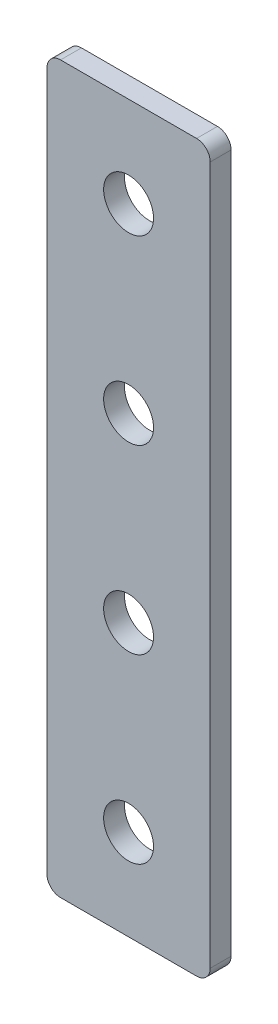
ISO-10303-21;
HEADER;
FILE_DESCRIPTION(('STEP AP214'),'2;1');
FILE_NAME('part.step','',(''),(''),'','','');
FILE_SCHEMA(('AUTOMOTIVE_DESIGN { 1 0 10303 214 1 1 1 1 }'));
ENDSEC;
DATA;
#1=APPLICATION_CONTEXT('core data for automotive mechanical design processes');
#2=APPLICATION_PROTOCOL_DEFINITION('international standard','automotive_design',2000,#1);
#3=PRODUCT_CONTEXT('',#1,'mechanical');
#4=PRODUCT('Part','Part','',(#3));
#5=PRODUCT_RELATED_PRODUCT_CATEGORY('part','',(#4));
#6=PRODUCT_DEFINITION_FORMATION('','',#4);
#7=PRODUCT_DEFINITION_CONTEXT('part definition',#1,'design');
#8=PRODUCT_DEFINITION('design','',#6,#7);
#9=PRODUCT_DEFINITION_SHAPE('','',#8);
#10=(LENGTH_UNIT() NAMED_UNIT(*) SI_UNIT(.MILLI.,.METRE.));
#11=(NAMED_UNIT(*) PLANE_ANGLE_UNIT() SI_UNIT($,.RADIAN.));
#12=(NAMED_UNIT(*) SI_UNIT($,.STERADIAN.) SOLID_ANGLE_UNIT());
#13=UNCERTAINTY_MEASURE_WITH_UNIT(LENGTH_MEASURE(1.E-05),#10,'distance_accuracy_value','');
#14=(GEOMETRIC_REPRESENTATION_CONTEXT(3) GLOBAL_UNCERTAINTY_ASSIGNED_CONTEXT((#13)) GLOBAL_UNIT_ASSIGNED_CONTEXT((#10,
#11,#12)) REPRESENTATION_CONTEXT('',''));
#15=CARTESIAN_POINT('',(0.,0.,0.));
#16=DIRECTION('',(0.,0.,1.));
#17=DIRECTION('',(1.,0.,0.));
#18=AXIS2_PLACEMENT_3D('',#15,#16,#17);
#19=CARTESIAN_POINT('',(-7.49999999999996,1.50000000000004,-2.3));
#20=DIRECTION('',(0.,0.,1.));
#21=DIRECTION('',(1.,0.,0.));
#22=AXIS2_PLACEMENT_3D('',#19,#20,#21);
#23=CYLINDRICAL_SURFACE('',#22,1.50000000000004);
#24=CARTESIAN_POINT('',(-7.49999999999996,1.50000000000004,0.));
#25=DIRECTION('',(0.,0.,1.));
#26=DIRECTION('',(1.,0.,0.));
#27=AXIS2_PLACEMENT_3D('',#24,#25,#26);
#28=CIRCLE('',#27,1.50000000000004);
#29=CARTESIAN_POINT('',(-9.,1.5,0.));
#30=VERTEX_POINT('',#29);
#31=CARTESIAN_POINT('',(-7.5,0.,0.));
#32=VERTEX_POINT('',#31);
#33=EDGE_CURVE('E132',#30,#32,#28,.T.);
#34=ORIENTED_EDGE('',*,*,#33,.F.);
#35=DIRECTION('',(0.,0.,1.));
#36=VECTOR('',#35,1.);
#37=CARTESIAN_POINT('',(-9.,1.5,-2.3));
#38=LINE('',#37,#36);
#39=CARTESIAN_POINT('',(-9.,1.5,-2.3));
#40=VERTEX_POINT('',#39);
#41=EDGE_CURVE('E11',#40,#30,#38,.T.);
#42=ORIENTED_EDGE('',*,*,#41,.F.);
#43=CARTESIAN_POINT('',(-7.49999999999996,1.50000000000004,-2.3));
#44=DIRECTION('',(0.,0.,1.));
#45=DIRECTION('',(1.,0.,0.));
#46=AXIS2_PLACEMENT_3D('',#43,#44,#45);
#47=CIRCLE('',#46,1.50000000000004);
#48=CARTESIAN_POINT('',(-7.5,0.,-2.3));
#49=VERTEX_POINT('',#48);
#50=EDGE_CURVE('E153',#40,#49,#47,.T.);
#51=ORIENTED_EDGE('',*,*,#50,.T.);
#52=DIRECTION('',(0.,0.,1.));
#53=VECTOR('',#52,1.);
#54=CARTESIAN_POINT('',(-7.5,0.,-2.3));
#55=LINE('',#54,#53);
#56=EDGE_CURVE('E38',#49,#32,#55,.T.);
#57=ORIENTED_EDGE('',*,*,#56,.T.);
#58=EDGE_LOOP('',(#34,#42,#51,#57));
#59=FACE_BOUND('',#58,.T.);
#60=ADVANCED_FACE('F35',(#59),#23,.T.);
#61=CARTESIAN_POINT('',(-9.,78.5,-2.3));
#62=DIRECTION('',(-1.,0.,0.));
#63=DIRECTION('',(0.,0.,1.));
#64=AXIS2_PLACEMENT_3D('',#61,#62,#63);
#65=PLANE('',#64);
#66=DIRECTION('',(0.,-1.,0.));
#67=VECTOR('',#66,1.);
#68=CARTESIAN_POINT('',(-9.,78.5,0.));
#69=LINE('',#68,#67);
#70=CARTESIAN_POINT('',(-9.,78.5,0.));
#71=VERTEX_POINT('',#70);
#72=EDGE_CURVE('E151',#71,#30,#69,.T.);
#73=ORIENTED_EDGE('',*,*,#72,.F.);
#74=DIRECTION('',(0.,0.,1.));
#75=VECTOR('',#74,1.);
#76=CARTESIAN_POINT('',(-9.,78.5,-2.3));
#77=LINE('',#76,#75);
#78=CARTESIAN_POINT('',(-9.,78.5,-2.3));
#79=VERTEX_POINT('',#78);
#80=EDGE_CURVE('E44',#79,#71,#77,.T.);
#81=ORIENTED_EDGE('',*,*,#80,.F.);
#82=DIRECTION('',(0.,-1.,0.));
#83=VECTOR('',#82,1.);
#84=CARTESIAN_POINT('',(-9.,78.5,-2.3));
#85=LINE('',#84,#83);
#86=EDGE_CURVE('E122',#79,#40,#85,.T.);
#87=ORIENTED_EDGE('',*,*,#86,.T.);
#88=ORIENTED_EDGE('',*,*,#41,.T.);
#89=EDGE_LOOP('',(#73,#81,#87,#88));
#90=FACE_BOUND('',#89,.T.);
#91=ADVANCED_FACE('F165',(#90),#65,.T.);
#92=CARTESIAN_POINT('',(-7.50000000000026,78.5000000000003,-2.3));
#93=DIRECTION('',(0.,0.,1.));
#94=DIRECTION('',(1.,0.,0.));
#95=AXIS2_PLACEMENT_3D('',#92,#93,#94);
#96=CYLINDRICAL_SURFACE('',#95,1.49999999999974);
#97=CARTESIAN_POINT('',(-7.50000000000026,78.5000000000003,0.));
#98=DIRECTION('',(0.,0.,1.));
#99=DIRECTION('',(1.,0.,0.));
#100=AXIS2_PLACEMENT_3D('',#97,#98,#99);
#101=CIRCLE('',#100,1.49999999999974);
#102=CARTESIAN_POINT('',(-7.5,80.,0.));
#103=VERTEX_POINT('',#102);
#104=EDGE_CURVE('E109',#103,#71,#101,.T.);
#105=ORIENTED_EDGE('',*,*,#104,.F.);
#106=DIRECTION('',(0.,0.,1.));
#107=VECTOR('',#106,1.);
#108=CARTESIAN_POINT('',(-7.5,80.,-2.3));
#109=LINE('',#108,#107);
#110=CARTESIAN_POINT('',(-7.5,80.,-2.3));
#111=VERTEX_POINT('',#110);
#112=EDGE_CURVE('E104',#111,#103,#109,.T.);
#113=ORIENTED_EDGE('',*,*,#112,.F.);
#114=CARTESIAN_POINT('',(-7.50000000000026,78.5000000000003,-2.3));
#115=DIRECTION('',(0.,0.,1.));
#116=DIRECTION('',(1.,0.,0.));
#117=AXIS2_PLACEMENT_3D('',#114,#115,#116);
#118=CIRCLE('',#117,1.49999999999974);
#119=EDGE_CURVE('E107',#111,#79,#118,.T.);
#120=ORIENTED_EDGE('',*,*,#119,.T.);
#121=ORIENTED_EDGE('',*,*,#80,.T.);
#122=EDGE_LOOP('',(#105,#113,#120,#121));
#123=FACE_BOUND('',#122,.T.);
#124=ADVANCED_FACE('F106',(#123),#96,.T.);
#125=CARTESIAN_POINT('',(7.5,80.,-2.3));
#126=DIRECTION('',(0.,1.,0.));
#127=DIRECTION('',(0.,0.,1.));
#128=AXIS2_PLACEMENT_3D('',#125,#126,#127);
#129=PLANE('',#128);
#130=DIRECTION('',(-1.,0.,0.));
#131=VECTOR('',#130,1.);
#132=CARTESIAN_POINT('',(7.5,80.,0.));
#133=LINE('',#132,#131);
#134=CARTESIAN_POINT('',(7.5,80.,0.));
#135=VERTEX_POINT('',#134);
#136=EDGE_CURVE('E148',#135,#103,#133,.T.);
#137=ORIENTED_EDGE('',*,*,#136,.F.);
#138=DIRECTION('',(0.,0.,1.));
#139=VECTOR('',#138,1.);
#140=CARTESIAN_POINT('',(7.5,80.,-2.3));
#141=LINE('',#140,#139);
#142=CARTESIAN_POINT('',(7.5,80.,-2.3));
#143=VERTEX_POINT('',#142);
#144=EDGE_CURVE('E114',#143,#135,#141,.T.);
#145=ORIENTED_EDGE('',*,*,#144,.F.);
#146=DIRECTION('',(-1.,0.,0.));
#147=VECTOR('',#146,1.);
#148=CARTESIAN_POINT('',(7.5,80.,-2.3));
#149=LINE('',#148,#147);
#150=EDGE_CURVE('E120',#143,#111,#149,.T.);
#151=ORIENTED_EDGE('',*,*,#150,.T.);
#152=ORIENTED_EDGE('',*,*,#112,.T.);
#153=EDGE_LOOP('',(#137,#145,#151,#152));
#154=FACE_BOUND('',#153,.T.);
#155=ADVANCED_FACE('F124',(#154),#129,.T.);
#156=CARTESIAN_POINT('',(7.50000000000026,78.5000000000003,-2.3));
#157=DIRECTION('',(0.,0.,1.));
#158=DIRECTION('',(1.,0.,0.));
#159=AXIS2_PLACEMENT_3D('',#156,#157,#158);
#160=CYLINDRICAL_SURFACE('',#159,1.49999999999974);
#161=CARTESIAN_POINT('',(7.50000000000026,78.5000000000003,0.));
#162=DIRECTION('',(0.,0.,1.));
#163=DIRECTION('',(1.,0.,0.));
#164=AXIS2_PLACEMENT_3D('',#161,#162,#163);
#165=CIRCLE('',#164,1.49999999999974);
#166=CARTESIAN_POINT('',(9.,78.5,0.));
#167=VERTEX_POINT('',#166);
#168=EDGE_CURVE('E145',#167,#135,#165,.T.);
#169=ORIENTED_EDGE('',*,*,#168,.F.);
#170=DIRECTION('',(0.,0.,1.));
#171=VECTOR('',#170,1.);
#172=CARTESIAN_POINT('',(9.,78.5,-2.3));
#173=LINE('',#172,#171);
#174=CARTESIAN_POINT('',(9.,78.5,-2.3));
#175=VERTEX_POINT('',#174);
#176=EDGE_CURVE('E157',#175,#167,#173,.T.);
#177=ORIENTED_EDGE('',*,*,#176,.F.);
#178=CARTESIAN_POINT('',(7.50000000000026,78.5000000000003,-2.3));
#179=DIRECTION('',(0.,0.,1.));
#180=DIRECTION('',(1.,0.,0.));
#181=AXIS2_PLACEMENT_3D('',#178,#179,#180);
#182=CIRCLE('',#181,1.49999999999974);
#183=EDGE_CURVE('E125',#175,#143,#182,.T.);
#184=ORIENTED_EDGE('',*,*,#183,.T.);
#185=ORIENTED_EDGE('',*,*,#144,.T.);
#186=EDGE_LOOP('',(#169,#177,#184,#185));
#187=FACE_BOUND('',#186,.T.);
#188=ADVANCED_FACE('F178',(#187),#160,.T.);
#189=CARTESIAN_POINT('',(9.,1.5,-2.3));
#190=DIRECTION('',(1.,0.,0.));
#191=DIRECTION('',(0.,0.,-1.));
#192=AXIS2_PLACEMENT_3D('',#189,#190,#191);
#193=PLANE('',#192);
#194=DIRECTION('',(0.,1.,0.));
#195=VECTOR('',#194,1.);
#196=CARTESIAN_POINT('',(9.,1.5,0.));
#197=LINE('',#196,#195);
#198=CARTESIAN_POINT('',(9.,1.5,0.));
#199=VERTEX_POINT('',#198);
#200=EDGE_CURVE('E142',#199,#167,#197,.T.);
#201=ORIENTED_EDGE('',*,*,#200,.F.);
#202=DIRECTION('',(0.,0.,1.));
#203=VECTOR('',#202,1.);
#204=CARTESIAN_POINT('',(9.,1.5,-2.3));
#205=LINE('',#204,#203);
#206=CARTESIAN_POINT('',(9.,1.5,-2.3));
#207=VERTEX_POINT('',#206);
#208=EDGE_CURVE('E159',#207,#199,#205,.T.);
#209=ORIENTED_EDGE('',*,*,#208,.F.);
#210=DIRECTION('',(0.,1.,0.));
#211=VECTOR('',#210,1.);
#212=CARTESIAN_POINT('',(9.,1.5,-2.3));
#213=LINE('',#212,#211);
#214=EDGE_CURVE('E127',#207,#175,#213,.T.);
#215=ORIENTED_EDGE('',*,*,#214,.T.);
#216=ORIENTED_EDGE('',*,*,#176,.T.);
#217=EDGE_LOOP('',(#201,#209,#215,#216));
#218=FACE_BOUND('',#217,.T.);
#219=ADVANCED_FACE('F181',(#218),#193,.T.);
#220=CARTESIAN_POINT('',(7.49999999999996,1.50000000000004,-2.3));
#221=DIRECTION('',(0.,0.,1.));
#222=DIRECTION('',(1.,0.,0.));
#223=AXIS2_PLACEMENT_3D('',#220,#221,#222);
#224=CYLINDRICAL_SURFACE('',#223,1.50000000000004);
#225=CARTESIAN_POINT('',(7.49999999999996,1.50000000000004,0.));
#226=DIRECTION('',(0.,0.,1.));
#227=DIRECTION('',(1.,0.,0.));
#228=AXIS2_PLACEMENT_3D('',#225,#226,#227);
#229=CIRCLE('',#228,1.50000000000004);
#230=CARTESIAN_POINT('',(7.5,0.,0.));
#231=VERTEX_POINT('',#230);
#232=EDGE_CURVE('E139',#231,#199,#229,.T.);
#233=ORIENTED_EDGE('',*,*,#232,.F.);
#234=DIRECTION('',(0.,0.,1.));
#235=VECTOR('',#234,1.);
#236=CARTESIAN_POINT('',(7.5,0.,-2.3));
#237=LINE('',#236,#235);
#238=CARTESIAN_POINT('',(7.5,0.,-2.3));
#239=VERTEX_POINT('',#238);
#240=EDGE_CURVE('E160',#239,#231,#237,.T.);
#241=ORIENTED_EDGE('',*,*,#240,.F.);
#242=CARTESIAN_POINT('',(7.49999999999996,1.50000000000004,-2.3));
#243=DIRECTION('',(0.,0.,1.));
#244=DIRECTION('',(1.,0.,0.));
#245=AXIS2_PLACEMENT_3D('',#242,#243,#244);
#246=CIRCLE('',#245,1.50000000000004);
#247=EDGE_CURVE('E247',#239,#207,#246,.T.);
#248=ORIENTED_EDGE('',*,*,#247,.T.);
#249=ORIENTED_EDGE('',*,*,#208,.T.);
#250=EDGE_LOOP('',(#233,#241,#248,#249));
#251=FACE_BOUND('',#250,.T.);
#252=ADVANCED_FACE('F185',(#251),#224,.T.);
#253=CARTESIAN_POINT('',(-7.5,0.,-2.3));
#254=DIRECTION('',(0.,-1.,0.));
#255=DIRECTION('',(0.,0.,-1.));
#256=AXIS2_PLACEMENT_3D('',#253,#254,#255);
#257=PLANE('',#256);
#258=DIRECTION('',(1.,0.,0.));
#259=VECTOR('',#258,1.);
#260=CARTESIAN_POINT('',(-7.5,0.,0.));
#261=LINE('',#260,#259);
#262=EDGE_CURVE('E135',#32,#231,#261,.T.);
#263=ORIENTED_EDGE('',*,*,#262,.F.);
#264=ORIENTED_EDGE('',*,*,#56,.F.);
#265=DIRECTION('',(1.,0.,0.));
#266=VECTOR('',#265,1.);
#267=CARTESIAN_POINT('',(-7.5,0.,-2.3));
#268=LINE('',#267,#266);
#269=EDGE_CURVE('E245',#49,#239,#268,.T.);
#270=ORIENTED_EDGE('',*,*,#269,.T.);
#271=ORIENTED_EDGE('',*,*,#240,.T.);
#272=EDGE_LOOP('',(#263,#264,#270,#271));
#273=FACE_BOUND('',#272,.T.);
#274=ADVANCED_FACE('F162',(#273),#257,.T.);
#275=CARTESIAN_POINT('',(-7.49999999999996,1.50000000000004,-2.3));
#276=DIRECTION('',(0.,0.,1.));
#277=DIRECTION('',(1.,0.,0.));
#278=AXIS2_PLACEMENT_3D('',#275,#276,#277);
#279=PLANE('',#278);
#280=CARTESIAN_POINT('',(0.,10.,-2.3));
#281=DIRECTION('',(0.,0.,1.));
#282=DIRECTION('',(1.,0.,0.));
#283=AXIS2_PLACEMENT_3D('',#280,#281,#282);
#284=CIRCLE('',#283,2.75);
#285=CARTESIAN_POINT('',(2.75,10.,-2.3));
#286=VERTEX_POINT('',#285);
#287=EDGE_CURVE('E220',#286,#286,#284,.T.);
#288=ORIENTED_EDGE('',*,*,#287,.T.);
#289=EDGE_LOOP('',(#288));
#290=FACE_BOUND('',#289,.T.);
#291=CARTESIAN_POINT('',(0.,30.,-2.3));
#292=DIRECTION('',(0.,0.,1.));
#293=DIRECTION('',(1.,0.,0.));
#294=AXIS2_PLACEMENT_3D('',#291,#292,#293);
#295=CIRCLE('',#294,2.75);
#296=CARTESIAN_POINT('',(2.75,30.,-2.3));
#297=VERTEX_POINT('',#296);
#298=EDGE_CURVE('E228',#297,#297,#295,.T.);
#299=ORIENTED_EDGE('',*,*,#298,.T.);
#300=EDGE_LOOP('',(#299));
#301=FACE_BOUND('',#300,.T.);
#302=CARTESIAN_POINT('',(0.,50.,-2.3));
#303=DIRECTION('',(0.,0.,1.));
#304=DIRECTION('',(1.,0.,0.));
#305=AXIS2_PLACEMENT_3D('',#302,#303,#304);
#306=CIRCLE('',#305,2.75);
#307=CARTESIAN_POINT('',(2.75,50.,-2.3));
#308=VERTEX_POINT('',#307);
#309=EDGE_CURVE('E234',#308,#308,#306,.T.);
#310=ORIENTED_EDGE('',*,*,#309,.T.);
#311=EDGE_LOOP('',(#310));
#312=FACE_BOUND('',#311,.T.);
#313=CARTESIAN_POINT('',(0.,70.,-2.3));
#314=DIRECTION('',(0.,0.,1.));
#315=DIRECTION('',(1.,0.,0.));
#316=AXIS2_PLACEMENT_3D('',#313,#314,#315);
#317=CIRCLE('',#316,2.75);
#318=CARTESIAN_POINT('',(2.75,70.,-2.3));
#319=VERTEX_POINT('',#318);
#320=EDGE_CURVE('E136',#319,#319,#317,.T.);
#321=ORIENTED_EDGE('',*,*,#320,.T.);
#322=EDGE_LOOP('',(#321));
#323=FACE_BOUND('',#322,.T.);
#324=ORIENTED_EDGE('',*,*,#50,.F.);
#325=ORIENTED_EDGE('',*,*,#86,.F.);
#326=ORIENTED_EDGE('',*,*,#119,.F.);
#327=ORIENTED_EDGE('',*,*,#150,.F.);
#328=ORIENTED_EDGE('',*,*,#183,.F.);
#329=ORIENTED_EDGE('',*,*,#214,.F.);
#330=ORIENTED_EDGE('',*,*,#247,.F.);
#331=ORIENTED_EDGE('',*,*,#269,.F.);
#332=EDGE_LOOP('',(#324,#325,#326,#327,#328,#329,#330,#331));
#333=FACE_BOUND('',#332,.T.);
#334=ADVANCED_FACE('F118',(#290,#301,#312,#323,#333),#279,.F.);
#335=CARTESIAN_POINT('',(-7.49999999999996,1.50000000000004,0.));
#336=DIRECTION('',(0.,0.,1.));
#337=DIRECTION('',(1.,0.,0.));
#338=AXIS2_PLACEMENT_3D('',#335,#336,#337);
#339=PLANE('',#338);
#340=CARTESIAN_POINT('',(0.,10.,0.));
#341=DIRECTION('',(0.,0.,1.));
#342=DIRECTION('',(1.,0.,0.));
#343=AXIS2_PLACEMENT_3D('',#340,#341,#342);
#344=CIRCLE('',#343,2.75);
#345=CARTESIAN_POINT('',(2.75,10.,0.));
#346=VERTEX_POINT('',#345);
#347=EDGE_CURVE('E223',#346,#346,#344,.T.);
#348=ORIENTED_EDGE('',*,*,#347,.F.);
#349=EDGE_LOOP('',(#348));
#350=FACE_BOUND('',#349,.T.);
#351=CARTESIAN_POINT('',(0.,30.,0.));
#352=DIRECTION('',(0.,0.,1.));
#353=DIRECTION('',(1.,0.,0.));
#354=AXIS2_PLACEMENT_3D('',#351,#352,#353);
#355=CIRCLE('',#354,2.75);
#356=CARTESIAN_POINT('',(2.75,30.,0.));
#357=VERTEX_POINT('',#356);
#358=EDGE_CURVE('E225',#357,#357,#355,.T.);
#359=ORIENTED_EDGE('',*,*,#358,.F.);
#360=EDGE_LOOP('',(#359));
#361=FACE_BOUND('',#360,.T.);
#362=CARTESIAN_POINT('',(0.,50.,0.));
#363=DIRECTION('',(0.,0.,1.));
#364=DIRECTION('',(1.,0.,0.));
#365=AXIS2_PLACEMENT_3D('',#362,#363,#364);
#366=CIRCLE('',#365,2.75);
#367=CARTESIAN_POINT('',(2.75,50.,0.));
#368=VERTEX_POINT('',#367);
#369=EDGE_CURVE('E231',#368,#368,#366,.T.);
#370=ORIENTED_EDGE('',*,*,#369,.F.);
#371=EDGE_LOOP('',(#370));
#372=FACE_BOUND('',#371,.T.);
#373=CARTESIAN_POINT('',(0.,70.,0.));
#374=DIRECTION('',(0.,0.,1.));
#375=DIRECTION('',(1.,0.,0.));
#376=AXIS2_PLACEMENT_3D('',#373,#374,#375);
#377=CIRCLE('',#376,2.75);
#378=CARTESIAN_POINT('',(2.75,70.,0.));
#379=VERTEX_POINT('',#378);
#380=EDGE_CURVE('E237',#379,#379,#377,.T.);
#381=ORIENTED_EDGE('',*,*,#380,.F.);
#382=EDGE_LOOP('',(#381));
#383=FACE_BOUND('',#382,.T.);
#384=ORIENTED_EDGE('',*,*,#33,.T.);
#385=ORIENTED_EDGE('',*,*,#262,.T.);
#386=ORIENTED_EDGE('',*,*,#232,.T.);
#387=ORIENTED_EDGE('',*,*,#200,.T.);
#388=ORIENTED_EDGE('',*,*,#168,.T.);
#389=ORIENTED_EDGE('',*,*,#136,.T.);
#390=ORIENTED_EDGE('',*,*,#104,.T.);
#391=ORIENTED_EDGE('',*,*,#72,.T.);
#392=EDGE_LOOP('',(#384,#385,#386,#387,#388,#389,#390,#391));
#393=FACE_BOUND('',#392,.T.);
#394=ADVANCED_FACE('F164',(#350,#361,#372,#383,#393),#339,.T.);
#395=CARTESIAN_POINT('',(0.,70.,-2.3));
#396=DIRECTION('',(0.,0.,1.));
#397=DIRECTION('',(1.,0.,0.));
#398=AXIS2_PLACEMENT_3D('',#395,#396,#397);
#399=CYLINDRICAL_SURFACE('',#398,2.75);
#400=ORIENTED_EDGE('',*,*,#320,.F.);
#401=EDGE_LOOP('',(#400));
#402=FACE_BOUND('',#401,.T.);
#403=ORIENTED_EDGE('',*,*,#380,.T.);
#404=EDGE_LOOP('',(#403));
#405=FACE_BOUND('',#404,.T.);
#406=ADVANCED_FACE('F197',(#402,#405),#399,.F.);
#407=CARTESIAN_POINT('',(0.,50.,-2.3));
#408=DIRECTION('',(0.,0.,1.));
#409=DIRECTION('',(1.,0.,0.));
#410=AXIS2_PLACEMENT_3D('',#407,#408,#409);
#411=CYLINDRICAL_SURFACE('',#410,2.75);
#412=ORIENTED_EDGE('',*,*,#309,.F.);
#413=EDGE_LOOP('',(#412));
#414=FACE_BOUND('',#413,.T.);
#415=ORIENTED_EDGE('',*,*,#369,.T.);
#416=EDGE_LOOP('',(#415));
#417=FACE_BOUND('',#416,.T.);
#418=ADVANCED_FACE('F204',(#414,#417),#411,.F.);
#419=CARTESIAN_POINT('',(0.,30.,-2.3));
#420=DIRECTION('',(0.,0.,1.));
#421=DIRECTION('',(1.,0.,0.));
#422=AXIS2_PLACEMENT_3D('',#419,#420,#421);
#423=CYLINDRICAL_SURFACE('',#422,2.75);
#424=ORIENTED_EDGE('',*,*,#298,.F.);
#425=EDGE_LOOP('',(#424));
#426=FACE_BOUND('',#425,.T.);
#427=ORIENTED_EDGE('',*,*,#358,.T.);
#428=EDGE_LOOP('',(#427));
#429=FACE_BOUND('',#428,.T.);
#430=ADVANCED_FACE('F208',(#426,#429),#423,.F.);
#431=CARTESIAN_POINT('',(0.,10.,-2.3));
#432=DIRECTION('',(0.,0.,1.));
#433=DIRECTION('',(1.,0.,0.));
#434=AXIS2_PLACEMENT_3D('',#431,#432,#433);
#435=CYLINDRICAL_SURFACE('',#434,2.75);
#436=ORIENTED_EDGE('',*,*,#287,.F.);
#437=EDGE_LOOP('',(#436));
#438=FACE_BOUND('',#437,.T.);
#439=ORIENTED_EDGE('',*,*,#347,.T.);
#440=EDGE_LOOP('',(#439));
#441=FACE_BOUND('',#440,.T.);
#442=ADVANCED_FACE('F212',(#438,#441),#435,.F.);
#443=CLOSED_SHELL('',(#60,#91,#124,#155,#188,#219,#252,#274,#334,#394,#406,#418,#430,#442));
#444=MANIFOLD_SOLID_BREP('B2',#443);
#445=ADVANCED_BREP_SHAPE_REPRESENTATION('',(#18,#444),#14);
#446=SHAPE_DEFINITION_REPRESENTATION(#9,#445);
ENDSEC;
END-ISO-10303-21;
